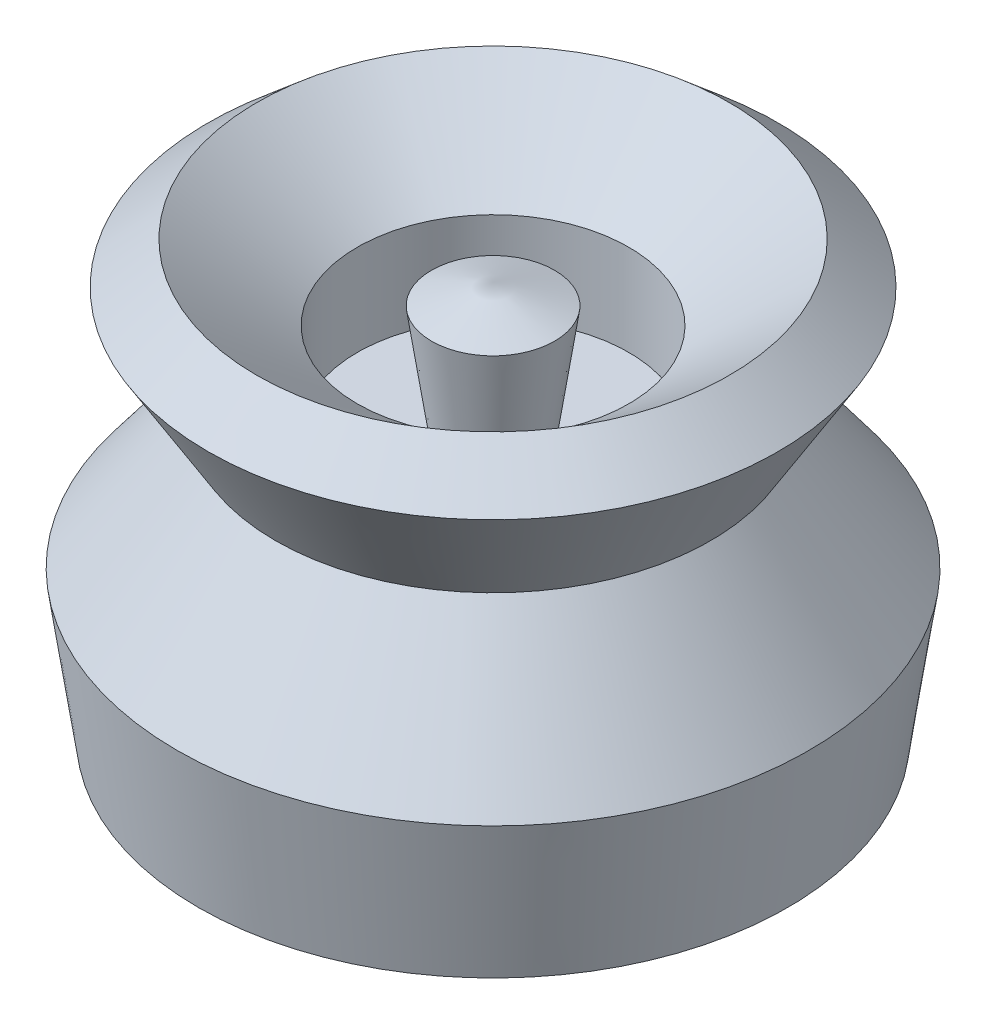
ISO-10303-21;
HEADER;
FILE_DESCRIPTION(('STEP AP214'),'2;1');
FILE_NAME('part.step','',(''),(''),'','','');
FILE_SCHEMA(('AUTOMOTIVE_DESIGN { 1 0 10303 214 1 1 1 1 }'));
ENDSEC;
DATA;
#1=APPLICATION_CONTEXT('core data for automotive mechanical design processes');
#2=APPLICATION_PROTOCOL_DEFINITION('international standard','automotive_design',2000,#1);
#3=PRODUCT_CONTEXT('',#1,'mechanical');
#4=PRODUCT('Part','Part','',(#3));
#5=PRODUCT_RELATED_PRODUCT_CATEGORY('part','',(#4));
#6=PRODUCT_DEFINITION_FORMATION('','',#4);
#7=PRODUCT_DEFINITION_CONTEXT('part definition',#1,'design');
#8=PRODUCT_DEFINITION('design','',#6,#7);
#9=PRODUCT_DEFINITION_SHAPE('','',#8);
#10=(LENGTH_UNIT() NAMED_UNIT(*) SI_UNIT(.MILLI.,.METRE.));
#11=(NAMED_UNIT(*) PLANE_ANGLE_UNIT() SI_UNIT($,.RADIAN.));
#12=(NAMED_UNIT(*) SI_UNIT($,.STERADIAN.) SOLID_ANGLE_UNIT());
#13=UNCERTAINTY_MEASURE_WITH_UNIT(LENGTH_MEASURE(1.E-05),#10,'distance_accuracy_value','');
#14=(GEOMETRIC_REPRESENTATION_CONTEXT(3) GLOBAL_UNCERTAINTY_ASSIGNED_CONTEXT((#13)) GLOBAL_UNIT_ASSIGNED_CONTEXT((#10,
#11,#12)) REPRESENTATION_CONTEXT('',''));
#15=CARTESIAN_POINT('',(0.,0.,0.));
#16=DIRECTION('',(0.,0.,1.));
#17=DIRECTION('',(1.,0.,0.));
#18=AXIS2_PLACEMENT_3D('',#15,#16,#17);
#19=CARTESIAN_POINT('',(0.,56.1983576915226,0.));
#20=DIRECTION('',(0.,-1.,0.));
#21=DIRECTION('',(0.,0.,-1.));
#22=AXIS2_PLACEMENT_3D('',#19,#20,#21);
#23=CONICAL_SURFACE('',#22,14.3247662523246,1.25134756897212);
#24=CARTESIAN_POINT('',(0.,60.9366714682905,0.));
#25=VERTEX_POINT('',#24);
#26=VERTEX_LOOP('',#25);
#27=FACE_BOUND('',#26,.T.);
#28=CARTESIAN_POINT('',(0.,56.1983576915226,0.));
#29=DIRECTION('',(0.,1.,0.));
#30=DIRECTION('',(0.,0.,1.));
#31=AXIS2_PLACEMENT_3D('',#28,#29,#30);
#32=CIRCLE('',#31,14.3247662523246);
#33=CARTESIAN_POINT('',(0.,56.1983576915226,14.3247662523246));
#34=VERTEX_POINT('',#33);
#35=EDGE_CURVE('E47',#34,#34,#32,.T.);
#36=ORIENTED_EDGE('',*,*,#35,.T.);
#37=EDGE_LOOP('',(#36));
#38=FACE_BOUND('',#37,.T.);
#39=ADVANCED_FACE('F33',(#27,#38),#23,.T.);
#40=CARTESIAN_POINT('',(0.,-30.9276709840638,0.));
#41=DIRECTION('',(0.,1.,0.));
#42=DIRECTION('',(0.,0.,1.));
#43=AXIS2_PLACEMENT_3D('',#40,#41,#42);
#44=PLANE('',#43);
#45=CARTESIAN_POINT('',(0.,-30.9276709840638,0.));
#46=DIRECTION('',(0.,1.,0.));
#47=DIRECTION('',(0.,0.,1.));
#48=AXIS2_PLACEMENT_3D('',#45,#46,#47);
#49=CIRCLE('',#48,68.6526322942955);
#50=CARTESIAN_POINT('',(0.,-30.9276709840638,68.6526322942955));
#51=VERTEX_POINT('',#50);
#52=EDGE_CURVE('E11',#51,#51,#49,.T.);
#53=ORIENTED_EDGE('',*,*,#52,.F.);
#54=EDGE_LOOP('',(#53));
#55=FACE_BOUND('',#54,.T.);
#56=ADVANCED_FACE('F44',(#55),#44,.F.);
#57=CARTESIAN_POINT('',(0.,-30.9276709840638,0.));
#58=DIRECTION('',(0.,1.,0.));
#59=DIRECTION('',(0.,0.,1.));
#60=AXIS2_PLACEMENT_3D('',#57,#58,#59);
#61=CONICAL_SURFACE('',#60,68.6526322942955,0.144677399617766);
#62=CARTESIAN_POINT('',(0.,3.28535699098114,0.));
#63=DIRECTION('',(0.,1.,0.));
#64=DIRECTION('',(0.,0.,1.));
#65=AXIS2_PLACEMENT_3D('',#62,#63,#64);
#66=CIRCLE('',#65,73.6373118668186);
#67=CARTESIAN_POINT('',(0.,3.28535699098114,73.6373118668186));
#68=VERTEX_POINT('',#67);
#69=EDGE_CURVE('E39',#68,#68,#66,.T.);
#70=ORIENTED_EDGE('',*,*,#69,.F.);
#71=EDGE_LOOP('',(#70));
#72=FACE_BOUND('',#71,.T.);
#73=ORIENTED_EDGE('',*,*,#52,.T.);
#74=EDGE_LOOP('',(#73));
#75=FACE_BOUND('',#74,.T.);
#76=ADVANCED_FACE('F73',(#72,#75),#61,.T.);
#77=CARTESIAN_POINT('',(0.,3.28535699098114,0.));
#78=DIRECTION('',(0.,-1.,0.));
#79=DIRECTION('',(0.,0.,-1.));
#80=AXIS2_PLACEMENT_3D('',#77,#78,#79);
#81=CONICAL_SURFACE('',#80,73.6373118668186,0.640720763779684);
#82=CARTESIAN_POINT('',(0.,34.089688123167,0.));
#83=DIRECTION('',(0.,1.,0.));
#84=DIRECTION('',(0.,0.,1.));
#85=AXIS2_PLACEMENT_3D('',#82,#83,#84);
#86=CIRCLE('',#85,50.6676083058244);
#87=CARTESIAN_POINT('',(0.,34.089688123167,50.6676083058244));
#88=VERTEX_POINT('',#87);
#89=EDGE_CURVE('E66',#88,#88,#86,.T.);
#90=ORIENTED_EDGE('',*,*,#89,.F.);
#91=EDGE_LOOP('',(#90));
#92=FACE_BOUND('',#91,.T.);
#93=ORIENTED_EDGE('',*,*,#69,.T.);
#94=EDGE_LOOP('',(#93));
#95=FACE_BOUND('',#94,.T.);
#96=ADVANCED_FACE('F71',(#92,#95),#81,.T.);
#97=CARTESIAN_POINT('',(0.,34.089688123167,0.));
#98=DIRECTION('',(0.,1.,0.));
#99=DIRECTION('',(0.,0.,1.));
#100=AXIS2_PLACEMENT_3D('',#97,#98,#99);
#101=CONICAL_SURFACE('',#100,50.6676083058244,0.546526585867403);
#102=CARTESIAN_POINT('',(0.,59.9294430423801,0.));
#103=DIRECTION('',(0.,1.,0.));
#104=DIRECTION('',(0.,0.,1.));
#105=AXIS2_PLACEMENT_3D('',#102,#103,#104);
#106=CIRCLE('',#105,66.3868688522395);
#107=CARTESIAN_POINT('',(0.,59.9294430423801,66.3868688522395));
#108=VERTEX_POINT('',#107);
#109=EDGE_CURVE('E63',#108,#108,#106,.T.);
#110=ORIENTED_EDGE('',*,*,#109,.F.);
#111=EDGE_LOOP('',(#110));
#112=FACE_BOUND('',#111,.T.);
#113=ORIENTED_EDGE('',*,*,#89,.T.);
#114=EDGE_LOOP('',(#113));
#115=FACE_BOUND('',#114,.T.);
#116=ADVANCED_FACE('F85',(#112,#115),#101,.T.);
#117=CARTESIAN_POINT('',(0.,59.9294430423801,0.));
#118=DIRECTION('',(0.,-1.,0.));
#119=DIRECTION('',(0.,0.,-1.));
#120=AXIS2_PLACEMENT_3D('',#117,#118,#119);
#121=CONICAL_SURFACE('',#120,66.3868688522395,0.86052531930821);
#122=CARTESIAN_POINT('',(0.,69.6722258432207,0.));
#123=DIRECTION('',(0.,1.,0.));
#124=DIRECTION('',(0.,0.,1.));
#125=AXIS2_PLACEMENT_3D('',#122,#123,#124);
#126=CIRCLE('',#125,55.0580516419598);
#127=CARTESIAN_POINT('',(0.,69.6722258432207,55.0580516419598));
#128=VERTEX_POINT('',#127);
#129=EDGE_CURVE('E60',#128,#128,#126,.T.);
#130=ORIENTED_EDGE('',*,*,#129,.F.);
#131=EDGE_LOOP('',(#130));
#132=FACE_BOUND('',#131,.T.);
#133=ORIENTED_EDGE('',*,*,#109,.T.);
#134=EDGE_LOOP('',(#133));
#135=FACE_BOUND('',#134,.T.);
#136=ADVANCED_FACE('F89',(#132,#135),#121,.T.);
#137=CARTESIAN_POINT('',(0.,69.6722258432207,0.));
#138=DIRECTION('',(0.,1.,0.));
#139=DIRECTION('',(0.,0.,1.));
#140=AXIS2_PLACEMENT_3D('',#137,#138,#139);
#141=CONICAL_SURFACE('',#140,55.0580516419598,0.930075563015213);
#142=CARTESIAN_POINT('',(0.,52.2011170933602,0.));
#143=DIRECTION('',(0.,1.,0.));
#144=DIRECTION('',(0.,0.,1.));
#145=AXIS2_PLACEMENT_3D('',#142,#143,#144);
#146=CIRCLE('',#145,31.6278050239299);
#147=CARTESIAN_POINT('',(0.,52.2011170933602,31.6278050239299));
#148=VERTEX_POINT('',#147);
#149=EDGE_CURVE('E57',#148,#148,#146,.T.);
#150=ORIENTED_EDGE('',*,*,#149,.F.);
#151=EDGE_LOOP('',(#150));
#152=FACE_BOUND('',#151,.T.);
#153=ORIENTED_EDGE('',*,*,#129,.T.);
#154=EDGE_LOOP('',(#153));
#155=FACE_BOUND('',#154,.T.);
#156=ADVANCED_FACE('F93',(#152,#155),#141,.F.);
#157=CARTESIAN_POINT('',(0.,37.4983849660261,0.));
#158=DIRECTION('',(0.,1.,0.));
#159=DIRECTION('',(0.,0.,1.));
#160=AXIS2_PLACEMENT_3D('',#157,#158,#159);
#161=CYLINDRICAL_SURFACE('',#160,31.6278050239299);
#162=CARTESIAN_POINT('',(0.,30.9698399972542,0.));
#163=DIRECTION('',(0.,1.,0.));
#164=DIRECTION('',(0.,0.,1.));
#165=AXIS2_PLACEMENT_3D('',#162,#163,#164);
#166=CIRCLE('',#165,31.6278050239299);
#167=CARTESIAN_POINT('',(0.,30.9698399972542,31.6278050239299));
#168=VERTEX_POINT('',#167);
#169=EDGE_CURVE('E52',#168,#168,#166,.T.);
#170=ORIENTED_EDGE('',*,*,#169,.F.);
#171=EDGE_LOOP('',(#170));
#172=FACE_BOUND('',#171,.T.);
#173=ORIENTED_EDGE('',*,*,#149,.T.);
#174=EDGE_LOOP('',(#173));
#175=FACE_BOUND('',#174,.T.);
#176=ADVANCED_FACE('F97',(#172,#175),#161,.F.);
#177=CARTESIAN_POINT('',(31.6278050239299,30.9698399972542,0.));
#178=DIRECTION('',(0.,-1.,0.));
#179=DIRECTION('',(0.,0.,-1.));
#180=AXIS2_PLACEMENT_3D('',#177,#178,#179);
#181=PLANE('',#180);
#182=CARTESIAN_POINT('',(0.,30.9698399972542,0.));
#183=DIRECTION('',(0.,1.,0.));
#184=DIRECTION('',(0.,0.,1.));
#185=AXIS2_PLACEMENT_3D('',#182,#183,#184);
#186=CIRCLE('',#185,10.649088177663);
#187=CARTESIAN_POINT('',(0.,30.9698399972542,10.649088177663));
#188=VERTEX_POINT('',#187);
#189=EDGE_CURVE('E49',#188,#188,#186,.T.);
#190=ORIENTED_EDGE('',*,*,#189,.F.);
#191=EDGE_LOOP('',(#190));
#192=FACE_BOUND('',#191,.T.);
#193=ORIENTED_EDGE('',*,*,#169,.T.);
#194=EDGE_LOOP('',(#193));
#195=FACE_BOUND('',#194,.T.);
#196=ADVANCED_FACE('F101',(#192,#195),#181,.F.);
#197=CARTESIAN_POINT('',(0.,30.9698399972542,0.));
#198=DIRECTION('',(0.,1.,0.));
#199=DIRECTION('',(0.,0.,1.));
#200=AXIS2_PLACEMENT_3D('',#197,#198,#199);
#201=CONICAL_SURFACE('',#200,10.649088177663,0.144677399617766);
#202=ORIENTED_EDGE('',*,*,#35,.F.);
#203=EDGE_LOOP('',(#202));
#204=FACE_BOUND('',#203,.T.);
#205=ORIENTED_EDGE('',*,*,#189,.T.);
#206=EDGE_LOOP('',(#205));
#207=FACE_BOUND('',#206,.T.);
#208=ADVANCED_FACE('F105',(#204,#207),#201,.T.);
#209=CLOSED_SHELL('',(#39,#56,#76,#96,#116,#136,#156,#176,#196,#208));
#210=MANIFOLD_SOLID_BREP('B2',#209);
#211=ADVANCED_BREP_SHAPE_REPRESENTATION('',(#18,#210),#14);
#212=SHAPE_DEFINITION_REPRESENTATION(#9,#211);
ENDSEC;
END-ISO-10303-21;
